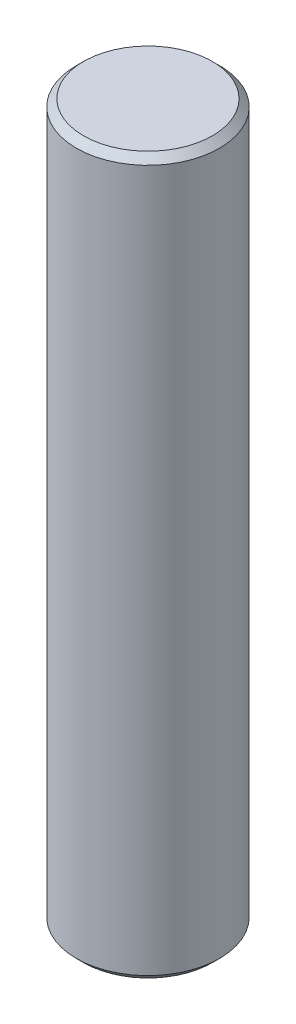
ISO-10303-21;
HEADER;
FILE_DESCRIPTION(('STEP AP214'),'2;1');
FILE_NAME('part.step','',(''),(''),'','','');
FILE_SCHEMA(('AUTOMOTIVE_DESIGN { 1 0 10303 214 1 1 1 1 }'));
ENDSEC;
DATA;
#1=APPLICATION_CONTEXT('core data for automotive mechanical design processes');
#2=APPLICATION_PROTOCOL_DEFINITION('international standard','automotive_design',2000,#1);
#3=PRODUCT_CONTEXT('',#1,'mechanical');
#4=PRODUCT('Part','Part','',(#3));
#5=PRODUCT_RELATED_PRODUCT_CATEGORY('part','',(#4));
#6=PRODUCT_DEFINITION_FORMATION('','',#4);
#7=PRODUCT_DEFINITION_CONTEXT('part definition',#1,'design');
#8=PRODUCT_DEFINITION('design','',#6,#7);
#9=PRODUCT_DEFINITION_SHAPE('','',#8);
#10=(LENGTH_UNIT() NAMED_UNIT(*) SI_UNIT(.MILLI.,.METRE.));
#11=(NAMED_UNIT(*) PLANE_ANGLE_UNIT() SI_UNIT($,.RADIAN.));
#12=(NAMED_UNIT(*) SI_UNIT($,.STERADIAN.) SOLID_ANGLE_UNIT());
#13=UNCERTAINTY_MEASURE_WITH_UNIT(LENGTH_MEASURE(1.E-05),#10,'distance_accuracy_value','');
#14=(GEOMETRIC_REPRESENTATION_CONTEXT(3) GLOBAL_UNCERTAINTY_ASSIGNED_CONTEXT((#13)) GLOBAL_UNIT_ASSIGNED_CONTEXT((#10,
#11,#12)) REPRESENTATION_CONTEXT('',''));
#15=CARTESIAN_POINT('',(0.,0.,0.));
#16=DIRECTION('',(0.,0.,1.));
#17=DIRECTION('',(1.,0.,0.));
#18=AXIS2_PLACEMENT_3D('',#15,#16,#17);
#19=CARTESIAN_POINT('',(0.,30.,0.));
#20=DIRECTION('',(0.,-1.,0.));
#21=DIRECTION('',(0.,0.,-1.));
#22=AXIS2_PLACEMENT_3D('',#19,#20,#21);
#23=CYLINDRICAL_SURFACE('',#22,3.);
#24=CARTESIAN_POINT('',(0.,29.7,0.));
#25=DIRECTION('',(0.,1.,0.));
#26=DIRECTION('',(0.,0.,1.));
#27=AXIS2_PLACEMENT_3D('',#24,#25,#26);
#28=CIRCLE('',#27,3.);
#29=CARTESIAN_POINT('',(0.,29.7,3.));
#30=VERTEX_POINT('',#29);
#31=EDGE_CURVE('E54',#30,#30,#28,.F.);
#32=ORIENTED_EDGE('',*,*,#31,.T.);
#33=EDGE_LOOP('',(#32));
#34=FACE_BOUND('',#33,.T.);
#35=CARTESIAN_POINT('',(0.,0.299999999999995,0.));
#36=DIRECTION('',(0.,1.,0.));
#37=DIRECTION('',(0.,0.,1.));
#38=AXIS2_PLACEMENT_3D('',#35,#36,#37);
#39=CIRCLE('',#38,3.);
#40=CARTESIAN_POINT('',(0.,0.299999999999995,3.));
#41=VERTEX_POINT('',#40);
#42=EDGE_CURVE('E58',#41,#41,#39,.T.);
#43=ORIENTED_EDGE('',*,*,#42,.T.);
#44=EDGE_LOOP('',(#43));
#45=FACE_BOUND('',#44,.T.);
#46=ADVANCED_FACE('F46',(#34,#45),#23,.T.);
#47=CARTESIAN_POINT('',(0.,30.,0.));
#48=DIRECTION('',(0.,1.,0.));
#49=DIRECTION('',(0.,0.,1.));
#50=AXIS2_PLACEMENT_3D('',#47,#48,#49);
#51=PLANE('',#50);
#52=CARTESIAN_POINT('',(0.,30.,0.));
#53=DIRECTION('',(0.,1.,0.));
#54=DIRECTION('',(0.,0.,1.));
#55=AXIS2_PLACEMENT_3D('',#52,#53,#54);
#56=CIRCLE('',#55,2.7);
#57=CARTESIAN_POINT('',(0.,30.,2.7));
#58=VERTEX_POINT('',#57);
#59=EDGE_CURVE('E62',#58,#58,#56,.T.);
#60=ORIENTED_EDGE('',*,*,#59,.T.);
#61=EDGE_LOOP('',(#60));
#62=FACE_BOUND('',#61,.T.);
#63=ADVANCED_FACE('F68',(#62),#51,.T.);
#64=CARTESIAN_POINT('',(0.,0.,0.));
#65=DIRECTION('',(0.,1.,0.));
#66=DIRECTION('',(0.,0.,1.));
#67=AXIS2_PLACEMENT_3D('',#64,#65,#66);
#68=PLANE('',#67);
#69=CARTESIAN_POINT('',(0.,0.,0.));
#70=DIRECTION('',(0.,1.,0.));
#71=DIRECTION('',(0.,0.,1.));
#72=AXIS2_PLACEMENT_3D('',#69,#70,#71);
#73=CIRCLE('',#72,2.70000000000001);
#74=CARTESIAN_POINT('',(0.,0.,2.70000000000001));
#75=VERTEX_POINT('',#74);
#76=EDGE_CURVE('E12',#75,#75,#73,.F.);
#77=ORIENTED_EDGE('',*,*,#76,.T.);
#78=EDGE_LOOP('',(#77));
#79=FACE_BOUND('',#78,.T.);
#80=ADVANCED_FACE('F72',(#79),#68,.F.);
#81=CARTESIAN_POINT('',(0.,30.,0.));
#82=DIRECTION('',(0.,-1.,0.));
#83=DIRECTION('',(0.,0.,-1.));
#84=AXIS2_PLACEMENT_3D('',#81,#82,#83);
#85=CONICAL_SURFACE('',#84,2.7,0.785398163397456);
#86=ORIENTED_EDGE('',*,*,#31,.F.);
#87=EDGE_LOOP('',(#86));
#88=FACE_BOUND('',#87,.T.);
#89=ORIENTED_EDGE('',*,*,#59,.F.);
#90=EDGE_LOOP('',(#89));
#91=FACE_BOUND('',#90,.T.);
#92=ADVANCED_FACE('F70',(#88,#91),#85,.T.);
#93=CARTESIAN_POINT('',(0.,0.299999999999995,0.));
#94=DIRECTION('',(0.,1.,0.));
#95=DIRECTION('',(0.,0.,1.));
#96=AXIS2_PLACEMENT_3D('',#93,#94,#95);
#97=CONICAL_SURFACE('',#96,3.,0.78539816339745);
#98=ORIENTED_EDGE('',*,*,#76,.F.);
#99=EDGE_LOOP('',(#98));
#100=FACE_BOUND('',#99,.T.);
#101=ORIENTED_EDGE('',*,*,#42,.F.);
#102=EDGE_LOOP('',(#101));
#103=FACE_BOUND('',#102,.T.);
#104=ADVANCED_FACE('F49',(#100,#103),#97,.T.);
#105=CLOSED_SHELL('',(#46,#63,#80,#92,#104));
#106=MANIFOLD_SOLID_BREP('B2',#105);
#107=ADVANCED_BREP_SHAPE_REPRESENTATION('',(#18,#106),#14);
#108=SHAPE_DEFINITION_REPRESENTATION(#9,#107);
ENDSEC;
END-ISO-10303-21;
